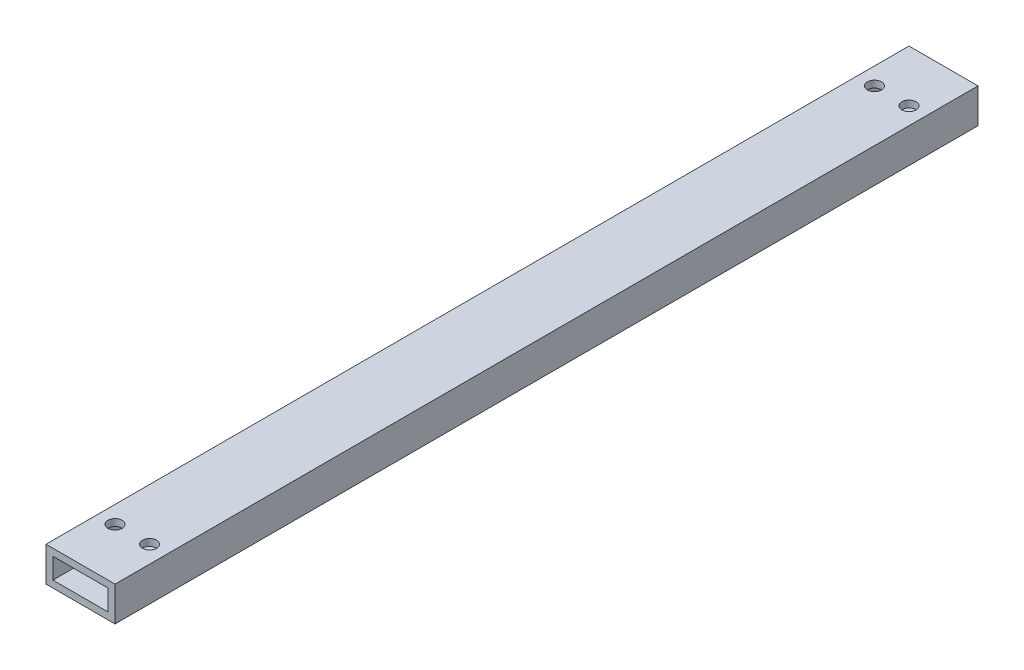
ISO-10303-21;
HEADER;
FILE_DESCRIPTION(('STEP AP214'),'2;1');
FILE_NAME('part.step','',(''),(''),'','','');
FILE_SCHEMA(('AUTOMOTIVE_DESIGN { 1 0 10303 214 1 1 1 1 }'));
ENDSEC;
DATA;
#1=APPLICATION_CONTEXT('core data for automotive mechanical design processes');
#2=APPLICATION_PROTOCOL_DEFINITION('international standard','automotive_design',2000,#1);
#3=PRODUCT_CONTEXT('',#1,'mechanical');
#4=PRODUCT('Part','Part','',(#3));
#5=PRODUCT_RELATED_PRODUCT_CATEGORY('part','',(#4));
#6=PRODUCT_DEFINITION_FORMATION('','',#4);
#7=PRODUCT_DEFINITION_CONTEXT('part definition',#1,'design');
#8=PRODUCT_DEFINITION('design','',#6,#7);
#9=PRODUCT_DEFINITION_SHAPE('','',#8);
#10=(LENGTH_UNIT() NAMED_UNIT(*) SI_UNIT(.MILLI.,.METRE.));
#11=(NAMED_UNIT(*) PLANE_ANGLE_UNIT() SI_UNIT($,.RADIAN.));
#12=(NAMED_UNIT(*) SI_UNIT($,.STERADIAN.) SOLID_ANGLE_UNIT());
#13=UNCERTAINTY_MEASURE_WITH_UNIT(LENGTH_MEASURE(1.E-05),#10,'distance_accuracy_value','');
#14=(GEOMETRIC_REPRESENTATION_CONTEXT(3) GLOBAL_UNCERTAINTY_ASSIGNED_CONTEXT((#13)) GLOBAL_UNIT_ASSIGNED_CONTEXT((#10,
#11,#12)) REPRESENTATION_CONTEXT('',''));
#15=CARTESIAN_POINT('',(0.,0.,0.));
#16=DIRECTION('',(0.,0.,1.));
#17=DIRECTION('',(1.,0.,0.));
#18=AXIS2_PLACEMENT_3D('',#15,#16,#17);
#19=CARTESIAN_POINT('',(0.,0.,125.));
#20=DIRECTION('',(0.,0.,1.));
#21=DIRECTION('',(1.,0.,0.));
#22=AXIS2_PLACEMENT_3D('',#19,#20,#21);
#23=PLANE('',#22);
#24=DIRECTION('',(0.,1.,0.));
#25=VECTOR('',#24,1.);
#26=CARTESIAN_POINT('',(10.0367537285158,5.03823934953629,125.));
#27=LINE('',#26,#25);
#28=CARTESIAN_POINT('',(10.0367537285158,-4.96176065046371,125.));
#29=VERTEX_POINT('',#28);
#30=CARTESIAN_POINT('',(10.0367537285158,5.03823934953629,125.));
#31=VERTEX_POINT('',#30);
#32=EDGE_CURVE('E146',#29,#31,#27,.T.);
#33=ORIENTED_EDGE('',*,*,#32,.T.);
#34=DIRECTION('',(-1.,0.,0.));
#35=VECTOR('',#34,1.);
#36=CARTESIAN_POINT('',(-9.96324627148418,5.03823934953629,125.));
#37=LINE('',#36,#35);
#38=CARTESIAN_POINT('',(-9.96324627148418,5.03823934953629,125.));
#39=VERTEX_POINT('',#38);
#40=EDGE_CURVE('E149',#31,#39,#37,.T.);
#41=ORIENTED_EDGE('',*,*,#40,.T.);
#42=DIRECTION('',(0.,-1.,0.));
#43=VECTOR('',#42,1.);
#44=CARTESIAN_POINT('',(-9.96324627148418,5.03823934953629,125.));
#45=LINE('',#44,#43);
#46=CARTESIAN_POINT('',(-9.96324627148418,-4.96176065046371,125.));
#47=VERTEX_POINT('',#46);
#48=EDGE_CURVE('E152',#39,#47,#45,.T.);
#49=ORIENTED_EDGE('',*,*,#48,.T.);
#50=DIRECTION('',(1.,0.,0.));
#51=VECTOR('',#50,1.);
#52=CARTESIAN_POINT('',(-9.96324627148418,-4.96176065046371,125.));
#53=LINE('',#52,#51);
#54=EDGE_CURVE('E154',#47,#29,#53,.T.);
#55=ORIENTED_EDGE('',*,*,#54,.T.);
#56=EDGE_LOOP('',(#33,#41,#49,#55));
#57=FACE_BOUND('',#56,.T.);
#58=DIRECTION('',(-1.,0.,0.));
#59=VECTOR('',#58,1.);
#60=CARTESIAN_POINT('',(-7.96324627148418,3.03823934953629,125.));
#61=LINE('',#60,#59);
#62=CARTESIAN_POINT('',(8.03675372851582,3.03823934953629,125.));
#63=VERTEX_POINT('',#62);
#64=CARTESIAN_POINT('',(-7.96324627148418,3.03823934953629,125.));
#65=VERTEX_POINT('',#64);
#66=EDGE_CURVE('E116',#63,#65,#61,.T.);
#67=ORIENTED_EDGE('',*,*,#66,.F.);
#68=DIRECTION('',(0.,1.,0.));
#69=VECTOR('',#68,1.);
#70=CARTESIAN_POINT('',(8.03675372851582,3.03823934953629,125.));
#71=LINE('',#70,#69);
#72=CARTESIAN_POINT('',(8.03675372851582,-2.96176065046371,125.));
#73=VERTEX_POINT('',#72);
#74=EDGE_CURVE('E108',#73,#63,#71,.T.);
#75=ORIENTED_EDGE('',*,*,#74,.F.);
#76=DIRECTION('',(1.,0.,0.));
#77=VECTOR('',#76,1.);
#78=CARTESIAN_POINT('',(-7.96324627148418,-2.96176065046371,125.));
#79=LINE('',#78,#77);
#80=CARTESIAN_POINT('',(-7.96324627148418,-2.96176065046371,125.));
#81=VERTEX_POINT('',#80);
#82=EDGE_CURVE('E130',#81,#73,#79,.T.);
#83=ORIENTED_EDGE('',*,*,#82,.F.);
#84=DIRECTION('',(0.,-1.,0.));
#85=VECTOR('',#84,1.);
#86=CARTESIAN_POINT('',(-7.96324627148418,3.03823934953629,125.));
#87=LINE('',#86,#85);
#88=EDGE_CURVE('E128',#65,#81,#87,.T.);
#89=ORIENTED_EDGE('',*,*,#88,.F.);
#90=EDGE_LOOP('',(#67,#75,#83,#89));
#91=FACE_BOUND('',#90,.T.);
#92=ADVANCED_FACE('F41',(#57,#91),#23,.T.);
#93=CARTESIAN_POINT('',(0.,0.,-125.));
#94=DIRECTION('',(0.,0.,1.));
#95=DIRECTION('',(1.,0.,0.));
#96=AXIS2_PLACEMENT_3D('',#93,#94,#95);
#97=PLANE('',#96);
#98=DIRECTION('',(0.,1.,0.));
#99=VECTOR('',#98,1.);
#100=CARTESIAN_POINT('',(10.0367537285158,5.03823934953629,-125.));
#101=LINE('',#100,#99);
#102=CARTESIAN_POINT('',(10.0367537285158,-4.96176065046371,-125.));
#103=VERTEX_POINT('',#102);
#104=CARTESIAN_POINT('',(10.0367537285158,5.03823934953629,-125.));
#105=VERTEX_POINT('',#104);
#106=EDGE_CURVE('E124',#103,#105,#101,.T.);
#107=ORIENTED_EDGE('',*,*,#106,.F.);
#108=DIRECTION('',(1.,0.,0.));
#109=VECTOR('',#108,1.);
#110=CARTESIAN_POINT('',(-9.96324627148418,-4.96176065046371,-125.));
#111=LINE('',#110,#109);
#112=CARTESIAN_POINT('',(-9.96324627148418,-4.96176065046371,-125.));
#113=VERTEX_POINT('',#112);
#114=EDGE_CURVE('E150',#113,#103,#111,.T.);
#115=ORIENTED_EDGE('',*,*,#114,.F.);
#116=DIRECTION('',(0.,-1.,0.));
#117=VECTOR('',#116,1.);
#118=CARTESIAN_POINT('',(-9.96324627148418,5.03823934953629,-125.));
#119=LINE('',#118,#117);
#120=CARTESIAN_POINT('',(-9.96324627148418,5.03823934953629,-125.));
#121=VERTEX_POINT('',#120);
#122=EDGE_CURVE('E161',#121,#113,#119,.T.);
#123=ORIENTED_EDGE('',*,*,#122,.F.);
#124=DIRECTION('',(-1.,0.,0.));
#125=VECTOR('',#124,1.);
#126=CARTESIAN_POINT('',(-9.96324627148418,5.03823934953629,-125.));
#127=LINE('',#126,#125);
#128=EDGE_CURVE('E159',#105,#121,#127,.T.);
#129=ORIENTED_EDGE('',*,*,#128,.F.);
#130=EDGE_LOOP('',(#107,#115,#123,#129));
#131=FACE_BOUND('',#130,.T.);
#132=DIRECTION('',(0.,1.,0.));
#133=VECTOR('',#132,1.);
#134=CARTESIAN_POINT('',(8.03675372851582,3.03823934953629,-125.));
#135=LINE('',#134,#133);
#136=CARTESIAN_POINT('',(8.03675372851582,-2.96176065046371,-125.));
#137=VERTEX_POINT('',#136);
#138=CARTESIAN_POINT('',(8.03675372851582,3.03823934953629,-125.));
#139=VERTEX_POINT('',#138);
#140=EDGE_CURVE('E66',#137,#139,#135,.T.);
#141=ORIENTED_EDGE('',*,*,#140,.T.);
#142=DIRECTION('',(-1.,0.,0.));
#143=VECTOR('',#142,1.);
#144=CARTESIAN_POINT('',(-7.96324627148418,3.03823934953629,-125.));
#145=LINE('',#144,#143);
#146=CARTESIAN_POINT('',(-7.96324627148418,3.03823934953629,-125.));
#147=VERTEX_POINT('',#146);
#148=EDGE_CURVE('E123',#139,#147,#145,.T.);
#149=ORIENTED_EDGE('',*,*,#148,.T.);
#150=DIRECTION('',(0.,-1.,0.));
#151=VECTOR('',#150,1.);
#152=CARTESIAN_POINT('',(-7.96324627148418,3.03823934953629,-125.));
#153=LINE('',#152,#151);
#154=CARTESIAN_POINT('',(-7.96324627148418,-2.96176065046371,-125.));
#155=VERTEX_POINT('',#154);
#156=EDGE_CURVE('E138',#147,#155,#153,.T.);
#157=ORIENTED_EDGE('',*,*,#156,.T.);
#158=DIRECTION('',(1.,0.,0.));
#159=VECTOR('',#158,1.);
#160=CARTESIAN_POINT('',(-7.96324627148418,-2.96176065046371,-125.));
#161=LINE('',#160,#159);
#162=EDGE_CURVE('E117',#155,#137,#161,.T.);
#163=ORIENTED_EDGE('',*,*,#162,.T.);
#164=EDGE_LOOP('',(#141,#149,#157,#163));
#165=FACE_BOUND('',#164,.T.);
#166=ADVANCED_FACE('F250',(#131,#165),#97,.F.);
#167=CARTESIAN_POINT('',(10.0367537285158,5.03823934953629,125.));
#168=DIRECTION('',(-1.,0.,0.));
#169=DIRECTION('',(0.,0.,1.));
#170=AXIS2_PLACEMENT_3D('',#167,#168,#169);
#171=PLANE('',#170);
#172=ORIENTED_EDGE('',*,*,#106,.T.);
#173=DIRECTION('',(0.,0.,-1.));
#174=VECTOR('',#173,1.);
#175=CARTESIAN_POINT('',(10.0367537285158,5.03823934953629,125.));
#176=LINE('',#175,#174);
#177=EDGE_CURVE('E11',#31,#105,#176,.T.);
#178=ORIENTED_EDGE('',*,*,#177,.F.);
#179=ORIENTED_EDGE('',*,*,#32,.F.);
#180=DIRECTION('',(0.,0.,-1.));
#181=VECTOR('',#180,1.);
#182=CARTESIAN_POINT('',(10.0367537285158,-4.96176065046371,125.));
#183=LINE('',#182,#181);
#184=EDGE_CURVE('E156',#29,#103,#183,.T.);
#185=ORIENTED_EDGE('',*,*,#184,.T.);
#186=EDGE_LOOP('',(#172,#178,#179,#185));
#187=FACE_BOUND('',#186,.T.);
#188=ADVANCED_FACE('F43',(#187),#171,.F.);
#189=CARTESIAN_POINT('',(-9.96324627148418,5.03823934953629,125.));
#190=DIRECTION('',(0.,-1.,0.));
#191=DIRECTION('',(0.,0.,-1.));
#192=AXIS2_PLACEMENT_3D('',#189,#190,#191);
#193=PLANE('',#192);
#194=CARTESIAN_POINT('',(-4.96324627148418,5.03823934953629,110.));
#195=DIRECTION('',(0.,-1.,0.));
#196=DIRECTION('',(0.,0.,-1.));
#197=AXIS2_PLACEMENT_3D('',#194,#195,#196);
#198=CIRCLE('',#197,2.05);
#199=CARTESIAN_POINT('',(-4.96324627148418,5.03823934953629,107.95));
#200=VERTEX_POINT('',#199);
#201=EDGE_CURVE('E187',#200,#200,#198,.T.);
#202=ORIENTED_EDGE('',*,*,#201,.T.);
#203=EDGE_LOOP('',(#202));
#204=FACE_BOUND('',#203,.T.);
#205=CARTESIAN_POINT('',(5.03675372851582,5.03823934953629,110.));
#206=DIRECTION('',(0.,-1.,0.));
#207=DIRECTION('',(0.,0.,1.));
#208=AXIS2_PLACEMENT_3D('',#205,#206,#207);
#209=CIRCLE('',#208,2.05);
#210=CARTESIAN_POINT('',(5.03675372851582,5.03823934953629,112.05));
#211=VERTEX_POINT('',#210);
#212=EDGE_CURVE('E197',#211,#211,#209,.T.);
#213=ORIENTED_EDGE('',*,*,#212,.T.);
#214=EDGE_LOOP('',(#213));
#215=FACE_BOUND('',#214,.T.);
#216=CARTESIAN_POINT('',(-4.96324627148418,5.03823934953629,-110.));
#217=DIRECTION('',(0.,1.,0.));
#218=DIRECTION('',(0.,0.,1.));
#219=AXIS2_PLACEMENT_3D('',#216,#217,#218);
#220=CIRCLE('',#219,2.05);
#221=CARTESIAN_POINT('',(-4.96324627148418,5.03823934953629,-107.95));
#222=VERTEX_POINT('',#221);
#223=EDGE_CURVE('E206',#222,#222,#220,.T.);
#224=ORIENTED_EDGE('',*,*,#223,.F.);
#225=EDGE_LOOP('',(#224));
#226=FACE_BOUND('',#225,.T.);
#227=CARTESIAN_POINT('',(5.03675372851582,5.03823934953629,-110.));
#228=DIRECTION('',(0.,1.,0.));
#229=DIRECTION('',(0.,0.,-1.));
#230=AXIS2_PLACEMENT_3D('',#227,#228,#229);
#231=CIRCLE('',#230,2.05);
#232=CARTESIAN_POINT('',(5.03675372851582,5.03823934953629,-112.05));
#233=VERTEX_POINT('',#232);
#234=EDGE_CURVE('E209',#233,#233,#231,.T.);
#235=ORIENTED_EDGE('',*,*,#234,.F.);
#236=EDGE_LOOP('',(#235));
#237=FACE_BOUND('',#236,.T.);
#238=ORIENTED_EDGE('',*,*,#128,.T.);
#239=DIRECTION('',(0.,0.,-1.));
#240=VECTOR('',#239,1.);
#241=CARTESIAN_POINT('',(-9.96324627148418,5.03823934953629,125.));
#242=LINE('',#241,#240);
#243=EDGE_CURVE('E50',#39,#121,#242,.T.);
#244=ORIENTED_EDGE('',*,*,#243,.F.);
#245=ORIENTED_EDGE('',*,*,#40,.F.);
#246=ORIENTED_EDGE('',*,*,#177,.T.);
#247=EDGE_LOOP('',(#238,#244,#245,#246));
#248=FACE_BOUND('',#247,.T.);
#249=ADVANCED_FACE('F236',(#204,#215,#226,#237,#248),#193,.F.);
#250=CARTESIAN_POINT('',(-9.96324627148418,5.03823934953629,125.));
#251=DIRECTION('',(1.,0.,0.));
#252=DIRECTION('',(0.,0.,-1.));
#253=AXIS2_PLACEMENT_3D('',#250,#251,#252);
#254=PLANE('',#253);
#255=ORIENTED_EDGE('',*,*,#122,.T.);
#256=DIRECTION('',(0.,0.,-1.));
#257=VECTOR('',#256,1.);
#258=CARTESIAN_POINT('',(-9.96324627148418,-4.96176065046371,125.));
#259=LINE('',#258,#257);
#260=EDGE_CURVE('E166',#47,#113,#259,.T.);
#261=ORIENTED_EDGE('',*,*,#260,.F.);
#262=ORIENTED_EDGE('',*,*,#48,.F.);
#263=ORIENTED_EDGE('',*,*,#243,.T.);
#264=EDGE_LOOP('',(#255,#261,#262,#263));
#265=FACE_BOUND('',#264,.T.);
#266=ADVANCED_FACE('F239',(#265),#254,.F.);
#267=CARTESIAN_POINT('',(-9.96324627148418,-4.96176065046371,125.));
#268=DIRECTION('',(0.,1.,0.));
#269=DIRECTION('',(-1.,0.,0.));
#270=AXIS2_PLACEMENT_3D('',#267,#268,#269);
#271=PLANE('',#270);
#272=CARTESIAN_POINT('',(-4.96324627148418,-4.96176065046371,110.));
#273=DIRECTION('',(0.,-1.,0.));
#274=DIRECTION('',(0.,0.,-1.));
#275=AXIS2_PLACEMENT_3D('',#272,#273,#274);
#276=CIRCLE('',#275,2.05);
#277=CARTESIAN_POINT('',(-4.96324627148418,-4.96176065046371,107.95));
#278=VERTEX_POINT('',#277);
#279=EDGE_CURVE('E181',#278,#278,#276,.T.);
#280=ORIENTED_EDGE('',*,*,#279,.F.);
#281=EDGE_LOOP('',(#280));
#282=FACE_BOUND('',#281,.T.);
#283=CARTESIAN_POINT('',(5.03675372851582,-4.96176065046371,110.));
#284=DIRECTION('',(0.,-1.,0.));
#285=DIRECTION('',(0.,0.,1.));
#286=AXIS2_PLACEMENT_3D('',#283,#284,#285);
#287=CIRCLE('',#286,2.05);
#288=CARTESIAN_POINT('',(5.03675372851582,-4.96176065046371,112.05));
#289=VERTEX_POINT('',#288);
#290=EDGE_CURVE('E192',#289,#289,#287,.T.);
#291=ORIENTED_EDGE('',*,*,#290,.F.);
#292=EDGE_LOOP('',(#291));
#293=FACE_BOUND('',#292,.T.);
#294=CARTESIAN_POINT('',(-4.96324627148418,-4.96176065046371,-110.));
#295=DIRECTION('',(0.,1.,0.));
#296=DIRECTION('',(0.,0.,1.));
#297=AXIS2_PLACEMENT_3D('',#294,#295,#296);
#298=CIRCLE('',#297,2.05);
#299=CARTESIAN_POINT('',(-4.96324627148418,-4.96176065046371,-107.95));
#300=VERTEX_POINT('',#299);
#301=EDGE_CURVE('E175',#300,#300,#298,.T.);
#302=ORIENTED_EDGE('',*,*,#301,.T.);
#303=EDGE_LOOP('',(#302));
#304=FACE_BOUND('',#303,.T.);
#305=CARTESIAN_POINT('',(5.03675372851582,-4.96176065046371,-110.));
#306=DIRECTION('',(0.,1.,0.));
#307=DIRECTION('',(0.,0.,-1.));
#308=AXIS2_PLACEMENT_3D('',#305,#306,#307);
#309=CIRCLE('',#308,2.05);
#310=CARTESIAN_POINT('',(5.03675372851582,-4.96176065046371,-112.05));
#311=VERTEX_POINT('',#310);
#312=EDGE_CURVE('E203',#311,#311,#309,.T.);
#313=ORIENTED_EDGE('',*,*,#312,.T.);
#314=EDGE_LOOP('',(#313));
#315=FACE_BOUND('',#314,.T.);
#316=ORIENTED_EDGE('',*,*,#114,.T.);
#317=ORIENTED_EDGE('',*,*,#184,.F.);
#318=ORIENTED_EDGE('',*,*,#54,.F.);
#319=ORIENTED_EDGE('',*,*,#260,.T.);
#320=EDGE_LOOP('',(#316,#317,#318,#319));
#321=FACE_BOUND('',#320,.T.);
#322=ADVANCED_FACE('F254',(#282,#293,#304,#315,#321),#271,.F.);
#323=CARTESIAN_POINT('',(8.03675372851582,3.03823934953629,125.));
#324=DIRECTION('',(-1.,0.,0.));
#325=DIRECTION('',(0.,0.,1.));
#326=AXIS2_PLACEMENT_3D('',#323,#324,#325);
#327=PLANE('',#326);
#328=ORIENTED_EDGE('',*,*,#140,.F.);
#329=DIRECTION('',(0.,0.,-1.));
#330=VECTOR('',#329,1.);
#331=CARTESIAN_POINT('',(8.03675372851582,-2.96176065046371,125.));
#332=LINE('',#331,#330);
#333=EDGE_CURVE('E112',#73,#137,#332,.T.);
#334=ORIENTED_EDGE('',*,*,#333,.F.);
#335=ORIENTED_EDGE('',*,*,#74,.T.);
#336=DIRECTION('',(0.,0.,-1.));
#337=VECTOR('',#336,1.);
#338=CARTESIAN_POINT('',(8.03675372851582,3.03823934953629,125.));
#339=LINE('',#338,#337);
#340=EDGE_CURVE('E111',#63,#139,#339,.T.);
#341=ORIENTED_EDGE('',*,*,#340,.T.);
#342=EDGE_LOOP('',(#328,#334,#335,#341));
#343=FACE_BOUND('',#342,.T.);
#344=ADVANCED_FACE('F110',(#343),#327,.T.);
#345=CARTESIAN_POINT('',(-7.96324627148418,3.03823934953629,125.));
#346=DIRECTION('',(0.,-1.,0.));
#347=DIRECTION('',(0.,0.,-1.));
#348=AXIS2_PLACEMENT_3D('',#345,#346,#347);
#349=PLANE('',#348);
#350=CARTESIAN_POINT('',(-4.96324627148418,3.03823934953629,110.));
#351=DIRECTION('',(0.,-1.,0.));
#352=DIRECTION('',(0.,0.,-1.));
#353=AXIS2_PLACEMENT_3D('',#350,#351,#352);
#354=CIRCLE('',#353,2.05);
#355=CARTESIAN_POINT('',(-4.96324627148418,3.03823934953629,107.95));
#356=VERTEX_POINT('',#355);
#357=EDGE_CURVE('E200',#356,#356,#354,.F.);
#358=ORIENTED_EDGE('',*,*,#357,.T.);
#359=EDGE_LOOP('',(#358));
#360=FACE_BOUND('',#359,.T.);
#361=CARTESIAN_POINT('',(5.03675372851582,3.03823934953629,110.));
#362=DIRECTION('',(0.,-1.,0.));
#363=DIRECTION('',(0.,0.,-1.));
#364=AXIS2_PLACEMENT_3D('',#361,#362,#363);
#365=CIRCLE('',#364,2.05);
#366=CARTESIAN_POINT('',(5.03675372851582,3.03823934953629,107.95));
#367=VERTEX_POINT('',#366);
#368=EDGE_CURVE('E180',#367,#367,#365,.F.);
#369=ORIENTED_EDGE('',*,*,#368,.T.);
#370=EDGE_LOOP('',(#369));
#371=FACE_BOUND('',#370,.T.);
#372=CARTESIAN_POINT('',(-4.96324627148418,3.03823934953629,-110.));
#373=DIRECTION('',(0.,-1.,0.));
#374=DIRECTION('',(0.,0.,-1.));
#375=AXIS2_PLACEMENT_3D('',#372,#373,#374);
#376=CIRCLE('',#375,2.05);
#377=CARTESIAN_POINT('',(-4.96324627148418,3.03823934953629,-112.05));
#378=VERTEX_POINT('',#377);
#379=EDGE_CURVE('E136',#378,#378,#376,.T.);
#380=ORIENTED_EDGE('',*,*,#379,.F.);
#381=EDGE_LOOP('',(#380));
#382=FACE_BOUND('',#381,.T.);
#383=CARTESIAN_POINT('',(5.03675372851582,3.03823934953629,-110.));
#384=DIRECTION('',(0.,-1.,0.));
#385=DIRECTION('',(0.,0.,-1.));
#386=AXIS2_PLACEMENT_3D('',#383,#384,#385);
#387=CIRCLE('',#386,2.05);
#388=CARTESIAN_POINT('',(5.03675372851582,3.03823934953629,-112.05));
#389=VERTEX_POINT('',#388);
#390=EDGE_CURVE('E174',#389,#389,#387,.T.);
#391=ORIENTED_EDGE('',*,*,#390,.F.);
#392=EDGE_LOOP('',(#391));
#393=FACE_BOUND('',#392,.T.);
#394=ORIENTED_EDGE('',*,*,#148,.F.);
#395=ORIENTED_EDGE('',*,*,#340,.F.);
#396=ORIENTED_EDGE('',*,*,#66,.T.);
#397=DIRECTION('',(0.,0.,-1.));
#398=VECTOR('',#397,1.);
#399=CARTESIAN_POINT('',(-7.96324627148418,3.03823934953629,125.));
#400=LINE('',#399,#398);
#401=EDGE_CURVE('E125',#65,#147,#400,.T.);
#402=ORIENTED_EDGE('',*,*,#401,.T.);
#403=EDGE_LOOP('',(#394,#395,#396,#402));
#404=FACE_BOUND('',#403,.T.);
#405=ADVANCED_FACE('F120',(#360,#371,#382,#393,#404),#349,.T.);
#406=CARTESIAN_POINT('',(-7.96324627148418,3.03823934953629,125.));
#407=DIRECTION('',(1.,0.,0.));
#408=DIRECTION('',(0.,0.,-1.));
#409=AXIS2_PLACEMENT_3D('',#406,#407,#408);
#410=PLANE('',#409);
#411=ORIENTED_EDGE('',*,*,#156,.F.);
#412=ORIENTED_EDGE('',*,*,#401,.F.);
#413=ORIENTED_EDGE('',*,*,#88,.T.);
#414=DIRECTION('',(0.,0.,-1.));
#415=VECTOR('',#414,1.);
#416=CARTESIAN_POINT('',(-7.96324627148418,-2.96176065046371,125.));
#417=LINE('',#416,#415);
#418=EDGE_CURVE('E58',#81,#155,#417,.T.);
#419=ORIENTED_EDGE('',*,*,#418,.T.);
#420=EDGE_LOOP('',(#411,#412,#413,#419));
#421=FACE_BOUND('',#420,.T.);
#422=ADVANCED_FACE('F223',(#421),#410,.T.);
#423=CARTESIAN_POINT('',(-7.96324627148418,-2.96176065046371,125.));
#424=DIRECTION('',(0.,1.,0.));
#425=DIRECTION('',(0.,0.,1.));
#426=AXIS2_PLACEMENT_3D('',#423,#424,#425);
#427=PLANE('',#426);
#428=CARTESIAN_POINT('',(-4.96324627148418,-2.96176065046371,110.));
#429=DIRECTION('',(0.,1.,0.));
#430=DIRECTION('',(0.,0.,1.));
#431=AXIS2_PLACEMENT_3D('',#428,#429,#430);
#432=CIRCLE('',#431,2.05);
#433=CARTESIAN_POINT('',(-4.96324627148418,-2.96176065046371,112.05));
#434=VERTEX_POINT('',#433);
#435=EDGE_CURVE('E45',#434,#434,#432,.F.);
#436=ORIENTED_EDGE('',*,*,#435,.T.);
#437=EDGE_LOOP('',(#436));
#438=FACE_BOUND('',#437,.T.);
#439=CARTESIAN_POINT('',(5.03675372851582,-2.96176065046371,110.));
#440=DIRECTION('',(0.,1.,0.));
#441=DIRECTION('',(0.,0.,1.));
#442=AXIS2_PLACEMENT_3D('',#439,#440,#441);
#443=CIRCLE('',#442,2.05);
#444=CARTESIAN_POINT('',(5.03675372851582,-2.96176065046371,112.05));
#445=VERTEX_POINT('',#444);
#446=EDGE_CURVE('E178',#445,#445,#443,.F.);
#447=ORIENTED_EDGE('',*,*,#446,.T.);
#448=EDGE_LOOP('',(#447));
#449=FACE_BOUND('',#448,.T.);
#450=CARTESIAN_POINT('',(-4.96324627148418,-2.96176065046371,-110.));
#451=DIRECTION('',(0.,1.,0.));
#452=DIRECTION('',(0.,0.,1.));
#453=AXIS2_PLACEMENT_3D('',#450,#451,#452);
#454=CIRCLE('',#453,2.05);
#455=CARTESIAN_POINT('',(-4.96324627148418,-2.96176065046371,-107.95));
#456=VERTEX_POINT('',#455);
#457=EDGE_CURVE('E176',#456,#456,#454,.T.);
#458=ORIENTED_EDGE('',*,*,#457,.F.);
#459=EDGE_LOOP('',(#458));
#460=FACE_BOUND('',#459,.T.);
#461=CARTESIAN_POINT('',(5.03675372851582,-2.96176065046371,-110.));
#462=DIRECTION('',(0.,1.,0.));
#463=DIRECTION('',(0.,0.,1.));
#464=AXIS2_PLACEMENT_3D('',#461,#462,#463);
#465=CIRCLE('',#464,2.05);
#466=CARTESIAN_POINT('',(5.03675372851582,-2.96176065046371,-107.95));
#467=VERTEX_POINT('',#466);
#468=EDGE_CURVE('E171',#467,#467,#465,.T.);
#469=ORIENTED_EDGE('',*,*,#468,.F.);
#470=EDGE_LOOP('',(#469));
#471=FACE_BOUND('',#470,.T.);
#472=ORIENTED_EDGE('',*,*,#162,.F.);
#473=ORIENTED_EDGE('',*,*,#418,.F.);
#474=ORIENTED_EDGE('',*,*,#82,.T.);
#475=ORIENTED_EDGE('',*,*,#333,.T.);
#476=EDGE_LOOP('',(#472,#473,#474,#475));
#477=FACE_BOUND('',#476,.T.);
#478=ADVANCED_FACE('F292',(#438,#449,#460,#471,#477),#427,.T.);
#479=CARTESIAN_POINT('',(5.03675372851582,-4.96176065046371,-110.));
#480=DIRECTION('',(0.,1.,0.));
#481=DIRECTION('',(0.,0.,1.));
#482=AXIS2_PLACEMENT_3D('',#479,#480,#481);
#483=CYLINDRICAL_SURFACE('',#482,2.05);
#484=ORIENTED_EDGE('',*,*,#468,.T.);
#485=EDGE_LOOP('',(#484));
#486=FACE_BOUND('',#485,.T.);
#487=ORIENTED_EDGE('',*,*,#312,.F.);
#488=EDGE_LOOP('',(#487));
#489=FACE_BOUND('',#488,.T.);
#490=ADVANCED_FACE('F233',(#486,#489),#483,.F.);
#491=CARTESIAN_POINT('',(-4.96324627148418,-4.96176065046371,-110.));
#492=DIRECTION('',(0.,1.,0.));
#493=DIRECTION('',(0.,0.,1.));
#494=AXIS2_PLACEMENT_3D('',#491,#492,#493);
#495=CYLINDRICAL_SURFACE('',#494,2.05);
#496=ORIENTED_EDGE('',*,*,#457,.T.);
#497=EDGE_LOOP('',(#496));
#498=FACE_BOUND('',#497,.T.);
#499=ORIENTED_EDGE('',*,*,#301,.F.);
#500=EDGE_LOOP('',(#499));
#501=FACE_BOUND('',#500,.T.);
#502=ADVANCED_FACE('F231',(#498,#501),#495,.F.);
#503=ORIENTED_EDGE('',*,*,#390,.T.);
#504=EDGE_LOOP('',(#503));
#505=FACE_BOUND('',#504,.T.);
#506=ORIENTED_EDGE('',*,*,#234,.T.);
#507=EDGE_LOOP('',(#506));
#508=FACE_BOUND('',#507,.T.);
#509=ADVANCED_FACE('F228',(#505,#508),#483,.F.);
#510=ORIENTED_EDGE('',*,*,#379,.T.);
#511=EDGE_LOOP('',(#510));
#512=FACE_BOUND('',#511,.T.);
#513=ORIENTED_EDGE('',*,*,#223,.T.);
#514=EDGE_LOOP('',(#513));
#515=FACE_BOUND('',#514,.T.);
#516=ADVANCED_FACE('F218',(#512,#515),#495,.F.);
#517=CARTESIAN_POINT('',(5.03675372851582,-4.96176065046371,110.));
#518=DIRECTION('',(0.,1.,0.));
#519=DIRECTION('',(0.,0.,1.));
#520=AXIS2_PLACEMENT_3D('',#517,#518,#519);
#521=CYLINDRICAL_SURFACE('',#520,2.05);
#522=ORIENTED_EDGE('',*,*,#446,.F.);
#523=EDGE_LOOP('',(#522));
#524=FACE_BOUND('',#523,.T.);
#525=ORIENTED_EDGE('',*,*,#290,.T.);
#526=EDGE_LOOP('',(#525));
#527=FACE_BOUND('',#526,.T.);
#528=ADVANCED_FACE('F321',(#524,#527),#521,.F.);
#529=CARTESIAN_POINT('',(-4.96324627148418,-4.96176065046371,110.));
#530=DIRECTION('',(0.,1.,0.));
#531=DIRECTION('',(0.,0.,1.));
#532=AXIS2_PLACEMENT_3D('',#529,#530,#531);
#533=CYLINDRICAL_SURFACE('',#532,2.05);
#534=ORIENTED_EDGE('',*,*,#435,.F.);
#535=EDGE_LOOP('',(#534));
#536=FACE_BOUND('',#535,.T.);
#537=ORIENTED_EDGE('',*,*,#279,.T.);
#538=EDGE_LOOP('',(#537));
#539=FACE_BOUND('',#538,.T.);
#540=ADVANCED_FACE('F348',(#536,#539),#533,.F.);
#541=ORIENTED_EDGE('',*,*,#368,.F.);
#542=EDGE_LOOP('',(#541));
#543=FACE_BOUND('',#542,.T.);
#544=ORIENTED_EDGE('',*,*,#212,.F.);
#545=EDGE_LOOP('',(#544));
#546=FACE_BOUND('',#545,.T.);
#547=ADVANCED_FACE('F351',(#543,#546),#521,.F.);
#548=ORIENTED_EDGE('',*,*,#357,.F.);
#549=EDGE_LOOP('',(#548));
#550=FACE_BOUND('',#549,.T.);
#551=ORIENTED_EDGE('',*,*,#201,.F.);
#552=EDGE_LOOP('',(#551));
#553=FACE_BOUND('',#552,.T.);
#554=ADVANCED_FACE('F360',(#550,#553),#533,.F.);
#555=CLOSED_SHELL('',(#92,#166,#188,#249,#266,#322,#344,#405,#422,#478,#490,#502,#509,#516,#528,
#540,#547,#554));
#556=MANIFOLD_SOLID_BREP('B2',#555);
#557=ADVANCED_BREP_SHAPE_REPRESENTATION('',(#18,#556),#14);
#558=SHAPE_DEFINITION_REPRESENTATION(#9,#557);
ENDSEC;
END-ISO-10303-21;
